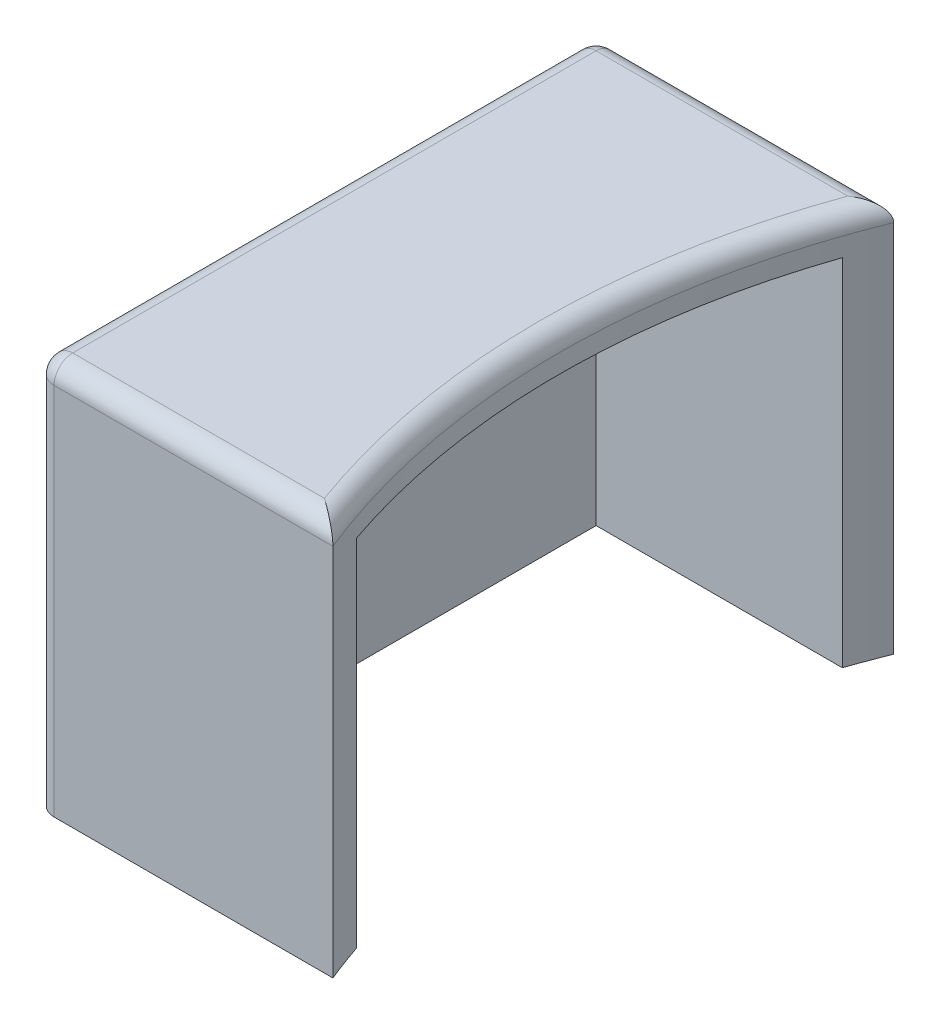
ISO-10303-21;
HEADER;
FILE_DESCRIPTION(('STEP AP214'),'2;1');
FILE_NAME('part.step','',(''),(''),'','','');
FILE_SCHEMA(('AUTOMOTIVE_DESIGN { 1 0 10303 214 1 1 1 1 }'));
ENDSEC;
DATA;
#1=APPLICATION_CONTEXT('core data for automotive mechanical design processes');
#2=APPLICATION_PROTOCOL_DEFINITION('international standard','automotive_design',2000,#1);
#3=PRODUCT_CONTEXT('',#1,'mechanical');
#4=PRODUCT('Part','Part','',(#3));
#5=PRODUCT_RELATED_PRODUCT_CATEGORY('part','',(#4));
#6=PRODUCT_DEFINITION_FORMATION('','',#4);
#7=PRODUCT_DEFINITION_CONTEXT('part definition',#1,'design');
#8=PRODUCT_DEFINITION('design','',#6,#7);
#9=PRODUCT_DEFINITION_SHAPE('','',#8);
#10=(LENGTH_UNIT() NAMED_UNIT(*) SI_UNIT(.MILLI.,.METRE.));
#11=(NAMED_UNIT(*) PLANE_ANGLE_UNIT() SI_UNIT($,.RADIAN.));
#12=(NAMED_UNIT(*) SI_UNIT($,.STERADIAN.) SOLID_ANGLE_UNIT());
#13=UNCERTAINTY_MEASURE_WITH_UNIT(LENGTH_MEASURE(1.E-05),#10,'distance_accuracy_value','');
#14=(GEOMETRIC_REPRESENTATION_CONTEXT(3) GLOBAL_UNCERTAINTY_ASSIGNED_CONTEXT((#13)) GLOBAL_UNIT_ASSIGNED_CONTEXT((#10,
#11,#12)) REPRESENTATION_CONTEXT('',''));
#15=CARTESIAN_POINT('',(0.,0.,0.));
#16=DIRECTION('',(0.,0.,1.));
#17=DIRECTION('',(1.,0.,0.));
#18=AXIS2_PLACEMENT_3D('',#15,#16,#17);
#19=CARTESIAN_POINT('',(0.,21.,0.));
#20=DIRECTION('',(0.,0.,-1.));
#21=DIRECTION('',(-1.,0.,0.));
#22=AXIS2_PLACEMENT_3D('',#19,#20,#21);
#23=PLANE('',#22);
#24=DIRECTION('',(1.,0.,0.));
#25=VECTOR('',#24,1.);
#26=CARTESIAN_POINT('',(0.,20.,0.));
#27=LINE('',#26,#25);
#28=CARTESIAN_POINT('',(15.92,20.,0.));
#29=VERTEX_POINT('',#28);
#30=CARTESIAN_POINT('',(1.,20.,0.));
#31=VERTEX_POINT('',#30);
#32=EDGE_CURVE('E192',#29,#31,#27,.F.);
#33=ORIENTED_EDGE('',*,*,#32,.T.);
#34=DIRECTION('',(0.,-1.,0.));
#35=VECTOR('',#34,1.);
#36=CARTESIAN_POINT('',(1.,21.,0.));
#37=LINE('',#36,#35);
#38=CARTESIAN_POINT('',(1.,0.,0.));
#39=VERTEX_POINT('',#38);
#40=EDGE_CURVE('E194',#31,#39,#37,.T.);
#41=ORIENTED_EDGE('',*,*,#40,.T.);
#42=DIRECTION('',(1.,0.,0.));
#43=VECTOR('',#42,1.);
#44=CARTESIAN_POINT('',(0.,0.,0.));
#45=LINE('',#44,#43);
#46=CARTESIAN_POINT('',(15.92,0.,0.));
#47=VERTEX_POINT('',#46);
#48=EDGE_CURVE('E164',#39,#47,#45,.T.);
#49=ORIENTED_EDGE('',*,*,#48,.T.);
#50=DIRECTION('',(0.,-1.,0.));
#51=VECTOR('',#50,1.);
#52=CARTESIAN_POINT('',(15.92,21.,0.));
#53=LINE('',#52,#51);
#54=EDGE_CURVE('E177',#29,#47,#53,.T.);
#55=ORIENTED_EDGE('',*,*,#54,.F.);
#56=EDGE_LOOP('',(#33,#41,#49,#55));
#57=FACE_BOUND('',#56,.T.);
#58=ADVANCED_FACE('F34',(#57),#23,.F.);
#59=CARTESIAN_POINT('',(53.,21.,-15.));
#60=DIRECTION('',(0.,-1.,0.));
#61=DIRECTION('',(0.,0.,-1.));
#62=AXIS2_PLACEMENT_3D('',#59,#60,#61);
#63=CYLINDRICAL_SURFACE('',#62,39.9990799894198);
#64=DIRECTION('',(0.,-1.,0.));
#65=VECTOR('',#64,1.);
#66=CARTESIAN_POINT('',(15.92,21.,-30.));
#67=LINE('',#66,#65);
#68=CARTESIAN_POINT('',(15.92,20.,-30.));
#69=VERTEX_POINT('',#68);
#70=CARTESIAN_POINT('',(15.92,0.,-30.));
#71=VERTEX_POINT('',#70);
#72=EDGE_CURVE('E175',#69,#71,#67,.T.);
#73=ORIENTED_EDGE('',*,*,#72,.F.);
#74=CARTESIAN_POINT('',(53.,20.,-15.));
#75=DIRECTION('',(0.,1.,0.));
#76=DIRECTION('',(0.,0.,1.));
#77=AXIS2_PLACEMENT_3D('',#74,#75,#76);
#78=CIRCLE('',#77,39.9990799894198);
#79=EDGE_CURVE('E189',#69,#29,#78,.T.);
#80=ORIENTED_EDGE('',*,*,#79,.T.);
#81=ORIENTED_EDGE('',*,*,#54,.T.);
#82=CARTESIAN_POINT('',(53.,0.,-15.));
#83=DIRECTION('',(0.,-1.,0.));
#84=DIRECTION('',(0.,0.,1.));
#85=AXIS2_PLACEMENT_3D('',#82,#83,#84);
#86=CIRCLE('',#85,39.9990799894198);
#87=CARTESIAN_POINT('',(15.1724121836985,0.,-2.));
#88=VERTEX_POINT('',#87);
#89=EDGE_CURVE('E167',#47,#88,#86,.T.);
#90=ORIENTED_EDGE('',*,*,#89,.T.);
#91=DIRECTION('',(0.,-1.,0.));
#92=VECTOR('',#91,1.);
#93=CARTESIAN_POINT('',(15.1724121836985,19.,-2.));
#94=LINE('',#93,#92);
#95=CARTESIAN_POINT('',(15.1724121836985,19.,-2.));
#96=VERTEX_POINT('',#95);
#97=EDGE_CURVE('E161',#96,#88,#94,.T.);
#98=ORIENTED_EDGE('',*,*,#97,.F.);
#99=CARTESIAN_POINT('',(53.,19.,-15.));
#100=DIRECTION('',(0.,1.,0.));
#101=DIRECTION('',(0.,0.,1.));
#102=AXIS2_PLACEMENT_3D('',#99,#100,#101);
#103=CIRCLE('',#102,39.9990799894198);
#104=CARTESIAN_POINT('',(15.1724121836985,19.,-28.));
#105=VERTEX_POINT('',#104);
#106=EDGE_CURVE('E147',#96,#105,#103,.F.);
#107=ORIENTED_EDGE('',*,*,#106,.T.);
#108=DIRECTION('',(0.,-1.,0.));
#109=VECTOR('',#108,1.);
#110=CARTESIAN_POINT('',(15.1724121836985,19.,-28.));
#111=LINE('',#110,#109);
#112=CARTESIAN_POINT('',(15.1724121836985,0.,-28.));
#113=VERTEX_POINT('',#112);
#114=EDGE_CURVE('E155',#105,#113,#111,.T.);
#115=ORIENTED_EDGE('',*,*,#114,.T.);
#116=EDGE_CURVE('E166',#113,#71,#86,.T.);
#117=ORIENTED_EDGE('',*,*,#116,.T.);
#118=EDGE_LOOP('',(#73,#80,#81,#90,#98,#107,#115,#117));
#119=FACE_BOUND('',#118,.T.);
#120=ADVANCED_FACE('F253',(#119),#63,.F.);
#121=CARTESIAN_POINT('',(15.92,21.,-30.));
#122=DIRECTION('',(0.,0.,1.));
#123=DIRECTION('',(1.,0.,0.));
#124=AXIS2_PLACEMENT_3D('',#121,#122,#123);
#125=PLANE('',#124);
#126=DIRECTION('',(-1.,0.,0.));
#127=VECTOR('',#126,1.);
#128=CARTESIAN_POINT('',(15.92,0.,-30.));
#129=LINE('',#128,#127);
#130=CARTESIAN_POINT('',(0.999999999999999,0.,-30.));
#131=VERTEX_POINT('',#130);
#132=EDGE_CURVE('E170',#71,#131,#129,.T.);
#133=ORIENTED_EDGE('',*,*,#132,.T.);
#134=DIRECTION('',(0.,-1.,0.));
#135=VECTOR('',#134,1.);
#136=CARTESIAN_POINT('',(0.999999999999999,21.,-30.));
#137=LINE('',#136,#135);
#138=CARTESIAN_POINT('',(1.,20.,-30.));
#139=VERTEX_POINT('',#138);
#140=EDGE_CURVE('E11',#131,#139,#137,.F.);
#141=ORIENTED_EDGE('',*,*,#140,.T.);
#142=DIRECTION('',(-1.,0.,0.));
#143=VECTOR('',#142,1.);
#144=CARTESIAN_POINT('',(15.92,20.,-30.));
#145=LINE('',#144,#143);
#146=EDGE_CURVE('E43',#139,#69,#145,.F.);
#147=ORIENTED_EDGE('',*,*,#146,.T.);
#148=ORIENTED_EDGE('',*,*,#72,.T.);
#149=EDGE_LOOP('',(#133,#141,#147,#148));
#150=FACE_BOUND('',#149,.T.);
#151=ADVANCED_FACE('F258',(#150),#125,.F.);
#152=CARTESIAN_POINT('',(0.,21.,0.));
#153=DIRECTION('',(1.,0.,0.));
#154=DIRECTION('',(0.,0.,-1.));
#155=AXIS2_PLACEMENT_3D('',#152,#153,#154);
#156=PLANE('',#155);
#157=DIRECTION('',(0.,0.,1.));
#158=VECTOR('',#157,1.);
#159=CARTESIAN_POINT('',(0.,0.,0.));
#160=LINE('',#159,#158);
#161=CARTESIAN_POINT('',(0.,0.,-29.));
#162=VERTEX_POINT('',#161);
#163=CARTESIAN_POINT('',(0.,0.,-1.));
#164=VERTEX_POINT('',#163);
#165=EDGE_CURVE('E172',#162,#164,#160,.T.);
#166=ORIENTED_EDGE('',*,*,#165,.T.);
#167=DIRECTION('',(0.,-1.,0.));
#168=VECTOR('',#167,1.);
#169=CARTESIAN_POINT('',(0.,21.,-1.));
#170=LINE('',#169,#168);
#171=CARTESIAN_POINT('',(0.,20.,-1.));
#172=VERTEX_POINT('',#171);
#173=EDGE_CURVE('E203',#164,#172,#170,.F.);
#174=ORIENTED_EDGE('',*,*,#173,.T.);
#175=DIRECTION('',(0.,0.,1.));
#176=VECTOR('',#175,1.);
#177=CARTESIAN_POINT('',(0.,20.,-30.));
#178=LINE('',#177,#176);
#179=CARTESIAN_POINT('',(0.,20.,-29.));
#180=VERTEX_POINT('',#179);
#181=EDGE_CURVE('E57',#172,#180,#178,.F.);
#182=ORIENTED_EDGE('',*,*,#181,.T.);
#183=DIRECTION('',(0.,-1.,0.));
#184=VECTOR('',#183,1.);
#185=CARTESIAN_POINT('',(0.,21.,-29.));
#186=LINE('',#185,#184);
#187=EDGE_CURVE('E201',#180,#162,#186,.T.);
#188=ORIENTED_EDGE('',*,*,#187,.T.);
#189=EDGE_LOOP('',(#166,#174,#182,#188));
#190=FACE_BOUND('',#189,.T.);
#191=ADVANCED_FACE('F264',(#190),#156,.F.);
#192=CARTESIAN_POINT('',(53.,21.,-15.));
#193=DIRECTION('',(0.,1.,0.));
#194=DIRECTION('',(0.,0.,1.));
#195=AXIS2_PLACEMENT_3D('',#192,#193,#194);
#196=PLANE('',#195);
#197=DIRECTION('',(0.,0.,1.));
#198=VECTOR('',#197,1.);
#199=CARTESIAN_POINT('',(1.,21.,0.));
#200=LINE('',#199,#198);
#201=CARTESIAN_POINT('',(1.,21.,-29.));
#202=VERTEX_POINT('',#201);
#203=CARTESIAN_POINT('',(1.,21.,-0.999999999999999));
#204=VERTEX_POINT('',#203);
#205=EDGE_CURVE('E182',#202,#204,#200,.T.);
#206=ORIENTED_EDGE('',*,*,#205,.T.);
#207=DIRECTION('',(1.,0.,0.));
#208=VECTOR('',#207,1.);
#209=CARTESIAN_POINT('',(15.92,21.,-0.999999999999999));
#210=LINE('',#209,#208);
#211=CARTESIAN_POINT('',(14.4652811093835,21.,-0.999999999999999));
#212=VERTEX_POINT('',#211);
#213=EDGE_CURVE('E187',#204,#212,#210,.T.);
#214=ORIENTED_EDGE('',*,*,#213,.T.);
#215=CARTESIAN_POINT('',(53.,21.,-15.));
#216=DIRECTION('',(0.,1.,0.));
#217=DIRECTION('',(0.,0.,1.));
#218=AXIS2_PLACEMENT_3D('',#215,#216,#217);
#219=CIRCLE('',#218,40.9990799894198);
#220=CARTESIAN_POINT('',(14.4652811093835,21.,-29.));
#221=VERTEX_POINT('',#220);
#222=EDGE_CURVE('E184',#212,#221,#219,.F.);
#223=ORIENTED_EDGE('',*,*,#222,.T.);
#224=DIRECTION('',(-1.,0.,0.));
#225=VECTOR('',#224,1.);
#226=CARTESIAN_POINT('',(0.,21.,-29.));
#227=LINE('',#226,#225);
#228=EDGE_CURVE('E180',#221,#202,#227,.T.);
#229=ORIENTED_EDGE('',*,*,#228,.T.);
#230=EDGE_LOOP('',(#206,#214,#223,#229));
#231=FACE_BOUND('',#230,.T.);
#232=ADVANCED_FACE('F267',(#231),#196,.T.);
#233=CARTESIAN_POINT('',(53.,0.,-15.));
#234=DIRECTION('',(0.,1.,0.));
#235=DIRECTION('',(0.,0.,1.));
#236=AXIS2_PLACEMENT_3D('',#233,#234,#235);
#237=PLANE('',#236);
#238=ORIENTED_EDGE('',*,*,#48,.F.);
#239=CARTESIAN_POINT('',(1.,0.,-1.));
#240=DIRECTION('',(0.,1.,0.));
#241=DIRECTION('',(0.,0.,1.));
#242=AXIS2_PLACEMENT_3D('',#239,#240,#241);
#243=CIRCLE('',#242,1.);
#244=EDGE_CURVE('E198',#39,#164,#243,.F.);
#245=ORIENTED_EDGE('',*,*,#244,.T.);
#246=ORIENTED_EDGE('',*,*,#165,.F.);
#247=CARTESIAN_POINT('',(1.,0.,-29.));
#248=DIRECTION('',(0.,1.,0.));
#249=DIRECTION('',(0.,0.,1.));
#250=AXIS2_PLACEMENT_3D('',#247,#248,#249);
#251=CIRCLE('',#250,1.);
#252=EDGE_CURVE('E196',#162,#131,#251,.F.);
#253=ORIENTED_EDGE('',*,*,#252,.T.);
#254=ORIENTED_EDGE('',*,*,#132,.F.);
#255=ORIENTED_EDGE('',*,*,#116,.F.);
#256=DIRECTION('',(-1.,0.,0.));
#257=VECTOR('',#256,1.);
#258=CARTESIAN_POINT('',(15.92,0.,-28.));
#259=LINE('',#258,#257);
#260=CARTESIAN_POINT('',(2.,0.,-28.));
#261=VERTEX_POINT('',#260);
#262=EDGE_CURVE('E151',#113,#261,#259,.T.);
#263=ORIENTED_EDGE('',*,*,#262,.T.);
#264=DIRECTION('',(0.,0.,1.));
#265=VECTOR('',#264,1.);
#266=CARTESIAN_POINT('',(2.,0.,0.));
#267=LINE('',#266,#265);
#268=CARTESIAN_POINT('',(2.,0.,-2.));
#269=VERTEX_POINT('',#268);
#270=EDGE_CURVE('E148',#261,#269,#267,.T.);
#271=ORIENTED_EDGE('',*,*,#270,.T.);
#272=DIRECTION('',(1.,0.,0.));
#273=VECTOR('',#272,1.);
#274=CARTESIAN_POINT('',(0.,0.,-2.));
#275=LINE('',#274,#273);
#276=EDGE_CURVE('E142',#269,#88,#275,.T.);
#277=ORIENTED_EDGE('',*,*,#276,.T.);
#278=ORIENTED_EDGE('',*,*,#89,.F.);
#279=EDGE_LOOP('',(#238,#245,#246,#253,#254,#255,#263,#271,#277,#278));
#280=FACE_BOUND('',#279,.T.);
#281=ADVANCED_FACE('F268',(#280),#237,.F.);
#282=CARTESIAN_POINT('',(0.,21.,-2.));
#283=DIRECTION('',(0.,0.,-1.));
#284=DIRECTION('',(-1.,0.,0.));
#285=AXIS2_PLACEMENT_3D('',#282,#283,#284);
#286=PLANE('',#285);
#287=ORIENTED_EDGE('',*,*,#276,.F.);
#288=DIRECTION('',(0.,-1.,0.));
#289=VECTOR('',#288,1.);
#290=CARTESIAN_POINT('',(2.,21.,-2.));
#291=LINE('',#290,#289);
#292=CARTESIAN_POINT('',(2.,19.,-2.));
#293=VERTEX_POINT('',#292);
#294=EDGE_CURVE('E127',#293,#269,#291,.T.);
#295=ORIENTED_EDGE('',*,*,#294,.F.);
#296=DIRECTION('',(1.,0.,0.));
#297=VECTOR('',#296,1.);
#298=CARTESIAN_POINT('',(0.,19.,-2.));
#299=LINE('',#298,#297);
#300=EDGE_CURVE('E139',#293,#96,#299,.T.);
#301=ORIENTED_EDGE('',*,*,#300,.T.);
#302=ORIENTED_EDGE('',*,*,#97,.T.);
#303=EDGE_LOOP('',(#287,#295,#301,#302));
#304=FACE_BOUND('',#303,.T.);
#305=ADVANCED_FACE('F138',(#304),#286,.T.);
#306=CARTESIAN_POINT('',(15.92,21.,-28.));
#307=DIRECTION('',(0.,0.,1.));
#308=DIRECTION('',(1.,0.,0.));
#309=AXIS2_PLACEMENT_3D('',#306,#307,#308);
#310=PLANE('',#309);
#311=ORIENTED_EDGE('',*,*,#262,.F.);
#312=ORIENTED_EDGE('',*,*,#114,.F.);
#313=DIRECTION('',(-1.,0.,0.));
#314=VECTOR('',#313,1.);
#315=CARTESIAN_POINT('',(15.92,19.,-28.));
#316=LINE('',#315,#314);
#317=CARTESIAN_POINT('',(2.,19.,-28.));
#318=VERTEX_POINT('',#317);
#319=EDGE_CURVE('E134',#105,#318,#316,.T.);
#320=ORIENTED_EDGE('',*,*,#319,.T.);
#321=DIRECTION('',(0.,-1.,0.));
#322=VECTOR('',#321,1.);
#323=CARTESIAN_POINT('',(2.,21.,-28.));
#324=LINE('',#323,#322);
#325=EDGE_CURVE('E130',#318,#261,#324,.T.);
#326=ORIENTED_EDGE('',*,*,#325,.T.);
#327=EDGE_LOOP('',(#311,#312,#320,#326));
#328=FACE_BOUND('',#327,.T.);
#329=ADVANCED_FACE('F279',(#328),#310,.T.);
#330=CARTESIAN_POINT('',(2.,21.,0.));
#331=DIRECTION('',(1.,0.,0.));
#332=DIRECTION('',(0.,0.,-1.));
#333=AXIS2_PLACEMENT_3D('',#330,#331,#332);
#334=PLANE('',#333);
#335=ORIENTED_EDGE('',*,*,#270,.F.);
#336=ORIENTED_EDGE('',*,*,#325,.F.);
#337=DIRECTION('',(0.,0.,1.));
#338=VECTOR('',#337,1.);
#339=CARTESIAN_POINT('',(2.,19.,0.));
#340=LINE('',#339,#338);
#341=EDGE_CURVE('E124',#318,#293,#340,.T.);
#342=ORIENTED_EDGE('',*,*,#341,.T.);
#343=ORIENTED_EDGE('',*,*,#294,.T.);
#344=EDGE_LOOP('',(#335,#336,#342,#343));
#345=FACE_BOUND('',#344,.T.);
#346=ADVANCED_FACE('F126',(#345),#334,.T.);
#347=CARTESIAN_POINT('',(53.,19.,-15.));
#348=DIRECTION('',(0.,1.,0.));
#349=DIRECTION('',(0.,0.,1.));
#350=AXIS2_PLACEMENT_3D('',#347,#348,#349);
#351=PLANE('',#350);
#352=ORIENTED_EDGE('',*,*,#300,.F.);
#353=ORIENTED_EDGE('',*,*,#341,.F.);
#354=ORIENTED_EDGE('',*,*,#319,.F.);
#355=ORIENTED_EDGE('',*,*,#106,.F.);
#356=EDGE_LOOP('',(#352,#353,#354,#355));
#357=FACE_BOUND('',#356,.T.);
#358=ADVANCED_FACE('F145',(#357),#351,.F.);
#359=CARTESIAN_POINT('',(1.,21.,-1.));
#360=DIRECTION('',(0.,-1.,0.));
#361=DIRECTION('',(0.,0.,-1.));
#362=AXIS2_PLACEMENT_3D('',#359,#360,#361);
#363=CYLINDRICAL_SURFACE('',#362,1.);
#364=ORIENTED_EDGE('',*,*,#244,.F.);
#365=ORIENTED_EDGE('',*,*,#40,.F.);
#366=CARTESIAN_POINT('',(1.,20.,-1.));
#367=DIRECTION('',(0.,1.,0.));
#368=DIRECTION('',(0.,0.,1.));
#369=AXIS2_PLACEMENT_3D('',#366,#367,#368);
#370=CIRCLE('',#369,1.);
#371=EDGE_CURVE('E38',#172,#31,#370,.T.);
#372=ORIENTED_EDGE('',*,*,#371,.F.);
#373=ORIENTED_EDGE('',*,*,#173,.F.);
#374=EDGE_LOOP('',(#364,#365,#372,#373));
#375=FACE_BOUND('',#374,.T.);
#376=ADVANCED_FACE('F36',(#375),#363,.T.);
#377=CARTESIAN_POINT('',(1.,20.,-15.));
#378=DIRECTION('',(0.,0.,-1.));
#379=DIRECTION('',(-1.,0.,0.));
#380=AXIS2_PLACEMENT_3D('',#377,#378,#379);
#381=CYLINDRICAL_SURFACE('',#380,1.);
#382=CARTESIAN_POINT('',(1.,20.,-29.));
#383=DIRECTION('',(0.,0.,-1.));
#384=DIRECTION('',(-1.,0.,0.));
#385=AXIS2_PLACEMENT_3D('',#382,#383,#384);
#386=CIRCLE('',#385,1.);
#387=EDGE_CURVE('E379',#180,#202,#386,.T.);
#388=ORIENTED_EDGE('',*,*,#387,.F.);
#389=ORIENTED_EDGE('',*,*,#181,.F.);
#390=CARTESIAN_POINT('',(1.,20.,-0.999999999999999));
#391=DIRECTION('',(0.,0.,1.));
#392=DIRECTION('',(1.,0.,0.));
#393=AXIS2_PLACEMENT_3D('',#390,#391,#392);
#394=CIRCLE('',#393,1.);
#395=EDGE_CURVE('E377',#204,#172,#394,.T.);
#396=ORIENTED_EDGE('',*,*,#395,.F.);
#397=ORIENTED_EDGE('',*,*,#205,.F.);
#398=EDGE_LOOP('',(#388,#389,#396,#397));
#399=FACE_BOUND('',#398,.T.);
#400=ADVANCED_FACE('F243',(#399),#381,.T.);
#401=CARTESIAN_POINT('',(1.,21.,-29.));
#402=DIRECTION('',(0.,-1.,0.));
#403=DIRECTION('',(0.,0.,-1.));
#404=AXIS2_PLACEMENT_3D('',#401,#402,#403);
#405=CYLINDRICAL_SURFACE('',#404,1.);
#406=ORIENTED_EDGE('',*,*,#252,.F.);
#407=ORIENTED_EDGE('',*,*,#187,.F.);
#408=CARTESIAN_POINT('',(1.,20.,-29.));
#409=DIRECTION('',(0.,1.,0.));
#410=DIRECTION('',(0.,0.,1.));
#411=AXIS2_PLACEMENT_3D('',#408,#409,#410);
#412=CIRCLE('',#411,1.);
#413=EDGE_CURVE('E383',#139,#180,#412,.T.);
#414=ORIENTED_EDGE('',*,*,#413,.F.);
#415=ORIENTED_EDGE('',*,*,#140,.F.);
#416=EDGE_LOOP('',(#406,#407,#414,#415));
#417=FACE_BOUND('',#416,.T.);
#418=ADVANCED_FACE('F240',(#417),#405,.T.);
#419=CARTESIAN_POINT('',(1.,20.,-1.));
#420=DIRECTION('',(0.,0.,1.));
#421=DIRECTION('',(1.,0.,0.));
#422=AXIS2_PLACEMENT_3D('',#419,#420,#421);
#423=SPHERICAL_SURFACE('',#422,1.);
#424=ORIENTED_EDGE('',*,*,#395,.T.);
#425=ORIENTED_EDGE('',*,*,#371,.T.);
#426=CARTESIAN_POINT('',(1.,20.,-1.));
#427=DIRECTION('',(-1.,0.,0.));
#428=DIRECTION('',(0.,-1.,0.));
#429=AXIS2_PLACEMENT_3D('',#426,#427,#428);
#430=CIRCLE('',#429,1.);
#431=EDGE_CURVE('E362',#204,#31,#430,.F.);
#432=ORIENTED_EDGE('',*,*,#431,.F.);
#433=EDGE_LOOP('',(#424,#425,#432));
#434=FACE_BOUND('',#433,.T.);
#435=ADVANCED_FACE('F236',(#434),#423,.T.);
#436=CARTESIAN_POINT('',(1.,20.,-29.));
#437=DIRECTION('',(0.,0.,1.));
#438=DIRECTION('',(1.,0.,0.));
#439=AXIS2_PLACEMENT_3D('',#436,#437,#438);
#440=SPHERICAL_SURFACE('',#439,1.);
#441=ORIENTED_EDGE('',*,*,#413,.T.);
#442=ORIENTED_EDGE('',*,*,#387,.T.);
#443=CARTESIAN_POINT('',(1.,20.,-29.));
#444=DIRECTION('',(-1.,0.,0.));
#445=DIRECTION('',(0.,0.,1.));
#446=AXIS2_PLACEMENT_3D('',#443,#444,#445);
#447=CIRCLE('',#446,1.);
#448=EDGE_CURVE('E359',#139,#202,#447,.F.);
#449=ORIENTED_EDGE('',*,*,#448,.F.);
#450=EDGE_LOOP('',(#441,#442,#449));
#451=FACE_BOUND('',#450,.T.);
#452=ADVANCED_FACE('F232',(#451),#440,.T.);
#453=CARTESIAN_POINT('',(53.,20.,-0.999999999999999));
#454=DIRECTION('',(-1.,0.,0.));
#455=DIRECTION('',(0.,0.,1.));
#456=AXIS2_PLACEMENT_3D('',#453,#454,#455);
#457=CYLINDRICAL_SURFACE('',#456,1.);
#458=ORIENTED_EDGE('',*,*,#431,.T.);
#459=ORIENTED_EDGE('',*,*,#32,.F.);
#460=CARTESIAN_POINT('',(15.92,20.,0.));
#461=CARTESIAN_POINT('',(15.9200646069726,20.0335081397669,4.2991440751475E-05));
#462=CARTESIAN_POINT('',(15.9175052883939,20.0669205481949,-0.00168189791521366));
#463=CARTESIAN_POINT('',(15.9077258339132,20.1324125355022,-0.00827616941481457));
#464=CARTESIAN_POINT('',(15.9005517632109,20.1645019877873,-0.0131144731294699));
#465=CARTESIAN_POINT('',(15.8801076087916,20.2336707493763,-0.0269085694607013));
#466=CARTESIAN_POINT('',(15.8658521722917,20.2703207846063,-0.0365302547927657));
#467=CARTESIAN_POINT('',(15.8325834844924,20.3404203322686,-0.0590025424670382));
#468=CARTESIAN_POINT('',(15.8135513176705,20.3738563716552,-0.071865982787783));
#469=CARTESIAN_POINT('',(15.7619335298439,20.4525653807831,-0.106785924472362));
#470=CARTESIAN_POINT('',(15.7272325943834,20.4957935721227,-0.130287791132511));
#471=CARTESIAN_POINT('',(15.6528677307928,20.575353180428,-0.180734808979689));
#472=CARTESIAN_POINT('',(15.6131943825513,20.6116711683174,-0.207686497886742));
#473=CARTESIAN_POINT('',(15.5370589282194,20.6730565182701,-0.259498311979779));
#474=CARTESIAN_POINT('',(15.5010620674546,20.6989951369659,-0.284028336543041));
#475=CARTESIAN_POINT('',(15.4273864441761,20.7470380944762,-0.334310383324346));
#476=CARTESIAN_POINT('',(15.3897065379142,20.7691397744012,-0.360063237314366));
#477=CARTESIAN_POINT('',(15.2747298608286,20.8303346626174,-0.43876875280318));
#478=CARTESIAN_POINT('',(15.1955907133394,20.8642457582849,-0.49310404956424));
#479=CARTESIAN_POINT('',(15.0627312770501,20.9105448307624,-0.584620502217227));
#480=CARTESIAN_POINT('',(15.009712421445,20.9263186237875,-0.621216763987073));
#481=CARTESIAN_POINT('',(14.9029359935649,20.9531876516012,-0.695075577942109));
#482=CARTESIAN_POINT('',(14.8491781497778,20.9642811166294,-0.732338376621476));
#483=CARTESIAN_POINT('',(14.6875163419775,20.990847234609,-0.84463638802777));
#484=CARTESIAN_POINT('',(14.5789121945699,20.9997099205227,-0.920396003824019));
#485=CARTESIAN_POINT('',(14.4688429511283,20.9999976500041,-0.997504506354332));
#486=CARTESIAN_POINT('',(14.4670619847367,20.9999999848993,-0.998752241419806));
#487=CARTESIAN_POINT('',(14.4652811093835,21.,-0.999999999999999));
#488=B_SPLINE_CURVE_WITH_KNOTS('',3,(#460,#461,#462,#463,#464,#465,#466,#467,#468,#469,#470,
#471,#472,#473,#474,#475,#476,#477,#478,#479,#480,#481,#482,#483,#484,#485,#486,#487),
.UNSPECIFIED.,.F.,.F.,(4,2,2,2,2,2,2,2,2,2,2,2,2,4),(0.,0.100227381763196,0.199469484508997,
0.320258366108275,0.441533325790702,0.621156729097712,0.801125719220231,0.953005641864315,
1.10499039646826,1.40936096629479,1.60819018847507,1.8070945262024,2.20373382313407,
2.21025748142181),.UNSPECIFIED.);
#489=EDGE_CURVE('E214',#212,#29,#488,.F.);
#490=ORIENTED_EDGE('',*,*,#489,.F.);
#491=ORIENTED_EDGE('',*,*,#213,.F.);
#492=EDGE_LOOP('',(#458,#459,#490,#491));
#493=FACE_BOUND('',#492,.T.);
#494=ADVANCED_FACE('F227',(#493),#457,.T.);
#495=CARTESIAN_POINT('',(53.,20.,-29.));
#496=DIRECTION('',(1.,0.,0.));
#497=DIRECTION('',(0.,0.,-1.));
#498=AXIS2_PLACEMENT_3D('',#495,#496,#497);
#499=CYLINDRICAL_SURFACE('',#498,1.);
#500=ORIENTED_EDGE('',*,*,#448,.T.);
#501=ORIENTED_EDGE('',*,*,#228,.F.);
#502=CARTESIAN_POINT('',(15.92,20.,-30.));
#503=CARTESIAN_POINT('',(15.9200646069726,20.0335081397669,-30.0000429914408));
#504=CARTESIAN_POINT('',(15.917505288394,20.0669205481949,-29.9983181020848));
#505=CARTESIAN_POINT('',(15.9077258339132,20.1324125355022,-29.9917238305852));
#506=CARTESIAN_POINT('',(15.9005517632109,20.1645019877873,-29.9868855268705));
#507=CARTESIAN_POINT('',(15.8801076087916,20.2336707493763,-29.9730914305393));
#508=CARTESIAN_POINT('',(15.8658521722917,20.2703207846063,-29.9634697452072));
#509=CARTESIAN_POINT('',(15.8325834844924,20.3404203322686,-29.940997457533));
#510=CARTESIAN_POINT('',(15.8135513176705,20.3738563716552,-29.9281340172122));
#511=CARTESIAN_POINT('',(15.7619335298439,20.4525653807831,-29.8932140755276));
#512=CARTESIAN_POINT('',(15.7272325943834,20.4957935721227,-29.8697122088675));
#513=CARTESIAN_POINT('',(15.6528677307928,20.575353180428,-29.8192651910203));
#514=CARTESIAN_POINT('',(15.6131943825513,20.6116711683174,-29.7923135021133));
#515=CARTESIAN_POINT('',(15.5370589282194,20.6730565182701,-29.7405016880202));
#516=CARTESIAN_POINT('',(15.5010620674546,20.6989951369659,-29.715971663457));
#517=CARTESIAN_POINT('',(15.4273864441761,20.7470380944762,-29.6656896166756));
#518=CARTESIAN_POINT('',(15.3897065379142,20.7691397744012,-29.6399367626856));
#519=CARTESIAN_POINT('',(15.2747298608286,20.8303346626174,-29.5612312471968));
#520=CARTESIAN_POINT('',(15.1955907133394,20.8642457582849,-29.5068959504358));
#521=CARTESIAN_POINT('',(15.0627312770501,20.9105448307624,-29.4153794977828));
#522=CARTESIAN_POINT('',(15.009712421445,20.9263186237875,-29.3787832360129));
#523=CARTESIAN_POINT('',(14.9029359935649,20.9531876516012,-29.3049244220579));
#524=CARTESIAN_POINT('',(14.8491781497779,20.9642811166294,-29.2676616233785));
#525=CARTESIAN_POINT('',(14.6875163419775,20.990847234609,-29.1553636119723));
#526=CARTESIAN_POINT('',(14.5789121945698,20.9997099205227,-29.0796039961762));
#527=CARTESIAN_POINT('',(14.4688429511283,20.9999976500041,-29.0024954936457));
#528=CARTESIAN_POINT('',(14.4670619847367,20.9999999848993,-29.0012477585802));
#529=CARTESIAN_POINT('',(14.4652811093835,21.,-29.));
#530=B_SPLINE_CURVE_WITH_KNOTS('',3,(#502,#503,#504,#505,#506,#507,#508,#509,#510,#511,#512,
#513,#514,#515,#516,#517,#518,#519,#520,#521,#522,#523,#524,#525,#526,#527,#528,#529),
.UNSPECIFIED.,.F.,.F.,(4,2,2,2,2,2,2,2,2,2,2,2,2,4),(0.,0.10022738176319,0.199469484509001,
0.320258366108279,0.441533325790706,0.621156729097719,0.801125719220236,0.953005641864318,
1.10499039646826,1.40936096629479,1.60819018847507,1.8070945262024,2.20373382313406,
2.21025748142181),.UNSPECIFIED.);
#531=EDGE_CURVE('E206',#69,#221,#530,.T.);
#532=ORIENTED_EDGE('',*,*,#531,.F.);
#533=ORIENTED_EDGE('',*,*,#146,.F.);
#534=EDGE_LOOP('',(#500,#501,#532,#533));
#535=FACE_BOUND('',#534,.T.);
#536=ADVANCED_FACE('F224',(#535),#499,.T.);
#537=CARTESIAN_POINT('',(53.,20.,-15.));
#538=DIRECTION('',(0.,1.,0.));
#539=DIRECTION('',(0.,0.,1.));
#540=AXIS2_PLACEMENT_3D('',#537,#538,#539);
#541=TOROIDAL_SURFACE('',#540,40.9990799894198,1.);
#542=ORIENTED_EDGE('',*,*,#489,.T.);
#543=ORIENTED_EDGE('',*,*,#79,.F.);
#544=ORIENTED_EDGE('',*,*,#531,.T.);
#545=ORIENTED_EDGE('',*,*,#222,.F.);
#546=EDGE_LOOP('',(#542,#543,#544,#545));
#547=FACE_BOUND('',#546,.T.);
#548=ADVANCED_FACE('F221',(#547),#541,.T.);
#549=CLOSED_SHELL('',(#58,#120,#151,#191,#232,#281,#305,#329,#346,#358,#376,#400,#418,#435,#452,
#494,#536,#548));
#550=MANIFOLD_SOLID_BREP('B2',#549);
#551=ADVANCED_BREP_SHAPE_REPRESENTATION('',(#18,#550),#14);
#552=SHAPE_DEFINITION_REPRESENTATION(#9,#551);
ENDSEC;
END-ISO-10303-21;
